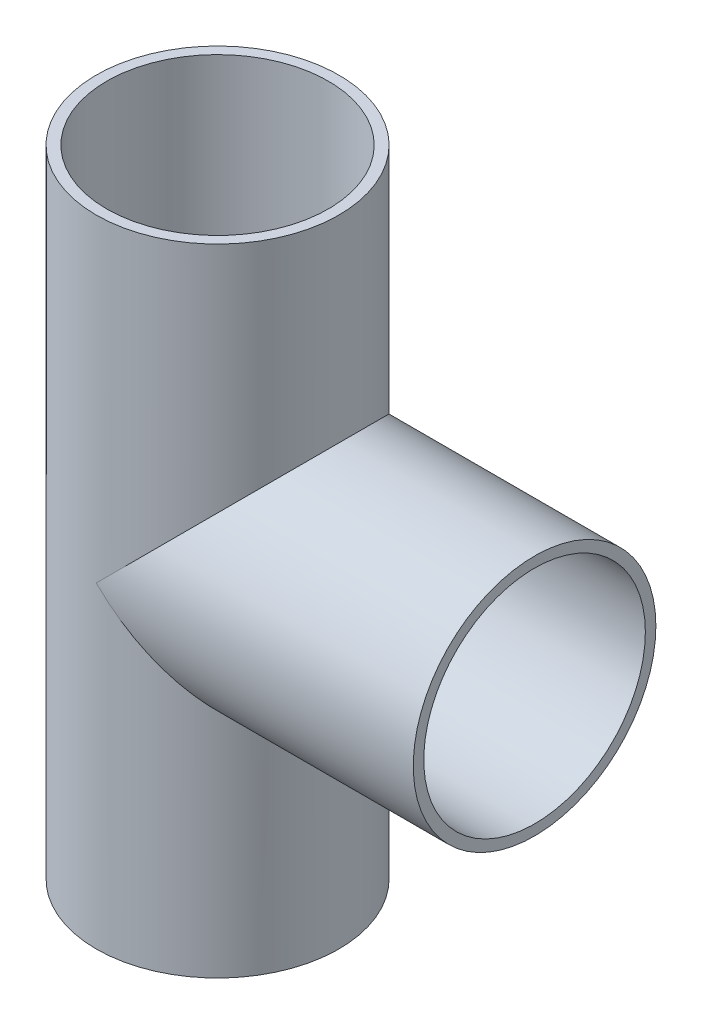
ISO-10303-21;
HEADER;
FILE_DESCRIPTION(('STEP AP214'),'2;1');
FILE_NAME('part.step','',(''),(''),'','','');
FILE_SCHEMA(('AUTOMOTIVE_DESIGN { 1 0 10303 214 1 1 1 1 }'));
ENDSEC;
DATA;
#1=APPLICATION_CONTEXT('core data for automotive mechanical design processes');
#2=APPLICATION_PROTOCOL_DEFINITION('international standard','automotive_design',2000,#1);
#3=PRODUCT_CONTEXT('',#1,'mechanical');
#4=PRODUCT('Part','Part','',(#3));
#5=PRODUCT_RELATED_PRODUCT_CATEGORY('part','',(#4));
#6=PRODUCT_DEFINITION_FORMATION('','',#4);
#7=PRODUCT_DEFINITION_CONTEXT('part definition',#1,'design');
#8=PRODUCT_DEFINITION('design','',#6,#7);
#9=PRODUCT_DEFINITION_SHAPE('','',#8);
#10=(LENGTH_UNIT() NAMED_UNIT(*) SI_UNIT(.MILLI.,.METRE.));
#11=(NAMED_UNIT(*) PLANE_ANGLE_UNIT() SI_UNIT($,.RADIAN.));
#12=(NAMED_UNIT(*) SI_UNIT($,.STERADIAN.) SOLID_ANGLE_UNIT());
#13=UNCERTAINTY_MEASURE_WITH_UNIT(LENGTH_MEASURE(1.E-05),#10,'distance_accuracy_value','');
#14=(GEOMETRIC_REPRESENTATION_CONTEXT(3) GLOBAL_UNCERTAINTY_ASSIGNED_CONTEXT((#13)) GLOBAL_UNIT_ASSIGNED_CONTEXT((#10,
#11,#12)) REPRESENTATION_CONTEXT('',''));
#15=CARTESIAN_POINT('',(0.,0.,0.));
#16=DIRECTION('',(0.,0.,1.));
#17=DIRECTION('',(1.,0.,0.));
#18=AXIS2_PLACEMENT_3D('',#15,#16,#17);
#19=CARTESIAN_POINT('',(0.,-49.784,0.));
#20=DIRECTION('',(0.,1.,0.));
#21=DIRECTION('',(0.,0.,1.));
#22=AXIS2_PLACEMENT_3D('',#19,#20,#21);
#23=CYLINDRICAL_SURFACE('',#22,19.05);
#24=CARTESIAN_POINT('',(0.,0.,0.));
#25=DIRECTION('',(0.707106781186547,0.707106781186547,0.));
#26=DIRECTION('',(0.707106781186547,-0.707106781186547,0.));
#27=AXIS2_PLACEMENT_3D('',#24,#25,#26);
#28=ELLIPSE('',#27,26.9407683632075,19.05);
#29=CARTESIAN_POINT('',(0.,0.,-19.05));
#30=VERTEX_POINT('',#29);
#31=CARTESIAN_POINT('',(0.,0.,19.05));
#32=VERTEX_POINT('',#31);
#33=EDGE_CURVE('E71',#30,#32,#28,.F.);
#34=ORIENTED_EDGE('',*,*,#33,.T.);
#35=CARTESIAN_POINT('',(0.,0.,0.));
#36=DIRECTION('',(0.707106781186547,-0.707106781186547,0.));
#37=DIRECTION('',(0.707106781186547,0.707106781186547,0.));
#38=AXIS2_PLACEMENT_3D('',#35,#36,#37);
#39=ELLIPSE('',#38,26.9407683632075,19.05);
#40=EDGE_CURVE('E50',#32,#30,#39,.F.);
#41=ORIENTED_EDGE('',*,*,#40,.T.);
#42=EDGE_LOOP('',(#34,#41));
#43=FACE_BOUND('',#42,.T.);
#44=CARTESIAN_POINT('',(0.,-49.784,0.));
#45=DIRECTION('',(0.,1.,0.));
#46=DIRECTION('',(0.,0.,1.));
#47=AXIS2_PLACEMENT_3D('',#44,#45,#46);
#48=CIRCLE('',#47,19.05);
#49=CARTESIAN_POINT('',(0.,-49.784,19.05));
#50=VERTEX_POINT('',#49);
#51=EDGE_CURVE('E11',#50,#50,#48,.T.);
#52=ORIENTED_EDGE('',*,*,#51,.T.);
#53=EDGE_LOOP('',(#52));
#54=FACE_BOUND('',#53,.T.);
#55=CARTESIAN_POINT('',(0.,50.038,0.));
#56=DIRECTION('',(0.,1.,0.));
#57=DIRECTION('',(0.,0.,1.));
#58=AXIS2_PLACEMENT_3D('',#55,#56,#57);
#59=CIRCLE('',#58,19.05);
#60=CARTESIAN_POINT('',(0.,50.038,19.05));
#61=VERTEX_POINT('',#60);
#62=EDGE_CURVE('E37',#61,#61,#59,.T.);
#63=ORIENTED_EDGE('',*,*,#62,.F.);
#64=EDGE_LOOP('',(#63));
#65=FACE_BOUND('',#64,.T.);
#66=ADVANCED_FACE('F30',(#43,#54,#65),#23,.T.);
#67=CARTESIAN_POINT('',(0.,-49.784,0.));
#68=DIRECTION('',(0.,1.,0.));
#69=DIRECTION('',(0.,0.,1.));
#70=AXIS2_PLACEMENT_3D('',#67,#68,#69);
#71=PLANE('',#70);
#72=CARTESIAN_POINT('',(0.,-49.784,0.));
#73=DIRECTION('',(0.,1.,0.));
#74=DIRECTION('',(0.,0.,1.));
#75=AXIS2_PLACEMENT_3D('',#72,#73,#74);
#76=CIRCLE('',#75,17.399);
#77=CARTESIAN_POINT('',(0.,-49.784,17.399));
#78=VERTEX_POINT('',#77);
#79=EDGE_CURVE('E58',#78,#78,#76,.T.);
#80=ORIENTED_EDGE('',*,*,#79,.T.);
#81=EDGE_LOOP('',(#80));
#82=FACE_BOUND('',#81,.T.);
#83=ORIENTED_EDGE('',*,*,#51,.F.);
#84=EDGE_LOOP('',(#83));
#85=FACE_BOUND('',#84,.T.);
#86=ADVANCED_FACE('F79',(#82,#85),#71,.F.);
#87=CARTESIAN_POINT('',(0.,50.038,0.));
#88=DIRECTION('',(0.,1.,0.));
#89=DIRECTION('',(0.,0.,1.));
#90=AXIS2_PLACEMENT_3D('',#87,#88,#89);
#91=PLANE('',#90);
#92=CARTESIAN_POINT('',(0.,50.038,0.));
#93=DIRECTION('',(0.,1.,0.));
#94=DIRECTION('',(0.,0.,1.));
#95=AXIS2_PLACEMENT_3D('',#92,#93,#94);
#96=CIRCLE('',#95,17.399);
#97=CARTESIAN_POINT('',(0.,50.038,17.399));
#98=VERTEX_POINT('',#97);
#99=EDGE_CURVE('E116',#98,#98,#96,.T.);
#100=ORIENTED_EDGE('',*,*,#99,.F.);
#101=EDGE_LOOP('',(#100));
#102=FACE_BOUND('',#101,.T.);
#103=ORIENTED_EDGE('',*,*,#62,.T.);
#104=EDGE_LOOP('',(#103));
#105=FACE_BOUND('',#104,.T.);
#106=ADVANCED_FACE('F76',(#102,#105),#91,.T.);
#107=CARTESIAN_POINT('',(49.784,0.,0.));
#108=DIRECTION('',(1.,0.,0.));
#109=DIRECTION('',(0.,0.,-1.));
#110=AXIS2_PLACEMENT_3D('',#107,#108,#109);
#111=PLANE('',#110);
#112=CARTESIAN_POINT('',(49.784,0.,0.));
#113=DIRECTION('',(1.,0.,0.));
#114=DIRECTION('',(0.,0.,-1.));
#115=AXIS2_PLACEMENT_3D('',#112,#113,#114);
#116=CIRCLE('',#115,17.399);
#117=CARTESIAN_POINT('',(49.784,0.,-17.399));
#118=VERTEX_POINT('',#117);
#119=EDGE_CURVE('E62',#118,#118,#116,.T.);
#120=ORIENTED_EDGE('',*,*,#119,.F.);
#121=EDGE_LOOP('',(#120));
#122=FACE_BOUND('',#121,.T.);
#123=CARTESIAN_POINT('',(49.784,0.,0.));
#124=DIRECTION('',(1.,0.,0.));
#125=DIRECTION('',(0.,0.,-1.));
#126=AXIS2_PLACEMENT_3D('',#123,#124,#125);
#127=CIRCLE('',#126,19.05);
#128=CARTESIAN_POINT('',(49.784,0.,-19.05));
#129=VERTEX_POINT('',#128);
#130=EDGE_CURVE('E68',#129,#129,#127,.T.);
#131=ORIENTED_EDGE('',*,*,#130,.T.);
#132=EDGE_LOOP('',(#131));
#133=FACE_BOUND('',#132,.T.);
#134=ADVANCED_FACE('F91',(#122,#133),#111,.T.);
#135=CARTESIAN_POINT('',(-500000.,0.,0.));
#136=DIRECTION('',(1.,0.,0.));
#137=DIRECTION('',(0.,0.,-1.));
#138=AXIS2_PLACEMENT_3D('',#135,#136,#137);
#139=CYLINDRICAL_SURFACE('',#138,19.05);
#140=ORIENTED_EDGE('',*,*,#33,.F.);
#141=ORIENTED_EDGE('',*,*,#40,.F.);
#142=EDGE_LOOP('',(#140,#141));
#143=FACE_BOUND('',#142,.T.);
#144=ORIENTED_EDGE('',*,*,#130,.F.);
#145=EDGE_LOOP('',(#144));
#146=FACE_BOUND('',#145,.T.);
#147=ADVANCED_FACE('F88',(#143,#146),#139,.T.);
#148=CARTESIAN_POINT('',(0.,0.,0.));
#149=DIRECTION('',(1.,0.,0.));
#150=DIRECTION('',(0.,0.,-1.));
#151=AXIS2_PLACEMENT_3D('',#148,#149,#150);
#152=CYLINDRICAL_SURFACE('',#151,17.399);
#153=CARTESIAN_POINT('',(0.,0.,0.));
#154=DIRECTION('',(0.707106781186547,-0.707106781186547,0.));
#155=DIRECTION('',(0.707106781186547,0.707106781186547,0.));
#156=AXIS2_PLACEMENT_3D('',#153,#154,#155);
#157=ELLIPSE('',#156,24.6059017717295,17.399);
#158=CARTESIAN_POINT('',(0.,0.,17.399));
#159=VERTEX_POINT('',#158);
#160=CARTESIAN_POINT('',(0.,0.,-17.399));
#161=VERTEX_POINT('',#160);
#162=EDGE_CURVE('E55',#159,#161,#157,.F.);
#163=ORIENTED_EDGE('',*,*,#162,.T.);
#164=CARTESIAN_POINT('',(0.,0.,0.));
#165=DIRECTION('',(0.707106781186547,0.707106781186547,0.));
#166=DIRECTION('',(0.707106781186547,-0.707106781186547,0.));
#167=AXIS2_PLACEMENT_3D('',#164,#165,#166);
#168=ELLIPSE('',#167,24.6059017717295,17.399);
#169=EDGE_CURVE('E43',#161,#159,#168,.F.);
#170=ORIENTED_EDGE('',*,*,#169,.T.);
#171=EDGE_LOOP('',(#163,#170));
#172=FACE_BOUND('',#171,.T.);
#173=ORIENTED_EDGE('',*,*,#119,.T.);
#174=EDGE_LOOP('',(#173));
#175=FACE_BOUND('',#174,.T.);
#176=ADVANCED_FACE('F60',(#172,#175),#152,.F.);
#177=CARTESIAN_POINT('',(0.,-49.784,0.));
#178=DIRECTION('',(0.,1.,0.));
#179=DIRECTION('',(0.,0.,1.));
#180=AXIS2_PLACEMENT_3D('',#177,#178,#179);
#181=CYLINDRICAL_SURFACE('',#180,17.399);
#182=ORIENTED_EDGE('',*,*,#99,.T.);
#183=EDGE_LOOP('',(#182));
#184=FACE_BOUND('',#183,.T.);
#185=ORIENTED_EDGE('',*,*,#79,.F.);
#186=EDGE_LOOP('',(#185));
#187=FACE_BOUND('',#186,.T.);
#188=ORIENTED_EDGE('',*,*,#162,.F.);
#189=ORIENTED_EDGE('',*,*,#169,.F.);
#190=EDGE_LOOP('',(#188,#189));
#191=FACE_BOUND('',#190,.T.);
#192=ADVANCED_FACE('F56',(#184,#187,#191),#181,.F.);
#193=CLOSED_SHELL('',(#66,#86,#106,#134,#147,#176,#192));
#194=MANIFOLD_SOLID_BREP('B2',#193);
#195=ADVANCED_BREP_SHAPE_REPRESENTATION('',(#18,#194),#14);
#196=SHAPE_DEFINITION_REPRESENTATION(#9,#195);
ENDSEC;
END-ISO-10303-21;
